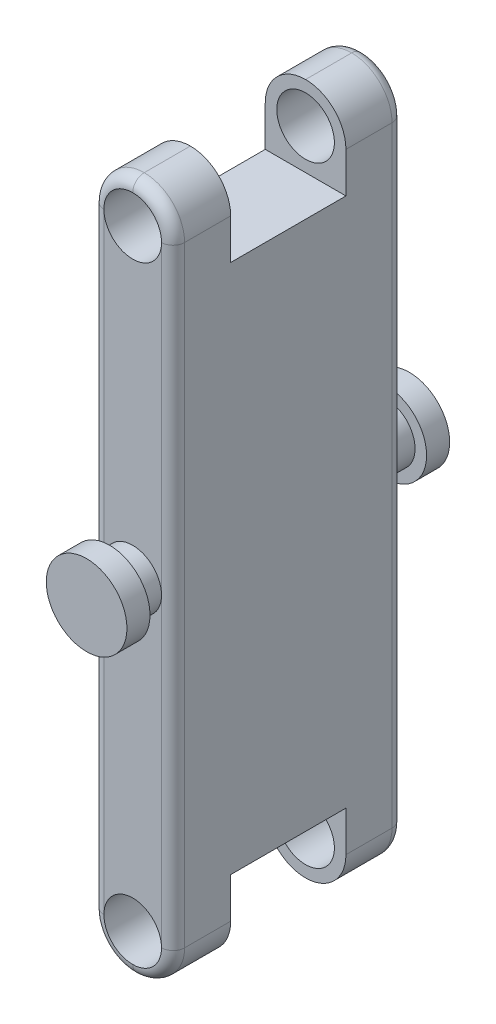
ISO-10303-21;
HEADER;
FILE_DESCRIPTION(('STEP AP214'),'2;1');
FILE_NAME('part.step','',(''),(''),'','','');
FILE_SCHEMA(('AUTOMOTIVE_DESIGN { 1 0 10303 214 1 1 1 1 }'));
ENDSEC;
DATA;
#1=APPLICATION_CONTEXT('core data for automotive mechanical design processes');
#2=APPLICATION_PROTOCOL_DEFINITION('international standard','automotive_design',2000,#1);
#3=PRODUCT_CONTEXT('',#1,'mechanical');
#4=PRODUCT('Part','Part','',(#3));
#5=PRODUCT_RELATED_PRODUCT_CATEGORY('part','',(#4));
#6=PRODUCT_DEFINITION_FORMATION('','',#4);
#7=PRODUCT_DEFINITION_CONTEXT('part definition',#1,'design');
#8=PRODUCT_DEFINITION('design','',#6,#7);
#9=PRODUCT_DEFINITION_SHAPE('','',#8);
#10=(LENGTH_UNIT() NAMED_UNIT(*) SI_UNIT(.MILLI.,.METRE.));
#11=(NAMED_UNIT(*) PLANE_ANGLE_UNIT() SI_UNIT($,.RADIAN.));
#12=(NAMED_UNIT(*) SI_UNIT($,.STERADIAN.) SOLID_ANGLE_UNIT());
#13=UNCERTAINTY_MEASURE_WITH_UNIT(LENGTH_MEASURE(1.E-05),#10,'distance_accuracy_value','');
#14=(GEOMETRIC_REPRESENTATION_CONTEXT(3) GLOBAL_UNCERTAINTY_ASSIGNED_CONTEXT((#13)) GLOBAL_UNIT_ASSIGNED_CONTEXT((#10,
#11,#12)) REPRESENTATION_CONTEXT('',''));
#15=CARTESIAN_POINT('',(0.,0.,0.));
#16=DIRECTION('',(0.,0.,1.));
#17=DIRECTION('',(1.,0.,0.));
#18=AXIS2_PLACEMENT_3D('',#15,#16,#17);
#19=CARTESIAN_POINT('',(0.,120.,-20.));
#20=DIRECTION('',(0.,0.,-1.));
#21=DIRECTION('',(-1.,0.,0.));
#22=AXIS2_PLACEMENT_3D('',#19,#20,#21);
#23=PLANE('',#22);
#24=CARTESIAN_POINT('',(7.00000000000001,113.,-20.));
#25=DIRECTION('',(0.,0.,-1.));
#26=DIRECTION('',(-1.,0.,0.));
#27=AXIS2_PLACEMENT_3D('',#24,#25,#26);
#28=CIRCLE('',#27,5.);
#29=CARTESIAN_POINT('',(12.,113.,-20.));
#30=VERTEX_POINT('',#29);
#31=CARTESIAN_POINT('',(1.99999999999999,113.,-20.));
#32=VERTEX_POINT('',#31);
#33=EDGE_CURVE('E511',#30,#32,#28,.T.);
#34=ORIENTED_EDGE('',*,*,#33,.F.);
#35=DIRECTION('',(0.,-1.,0.));
#36=VECTOR('',#35,1.);
#37=CARTESIAN_POINT('',(12.,7.00000000000001,-20.));
#38=LINE('',#37,#36);
#39=CARTESIAN_POINT('',(12.,60.,-20.));
#40=VERTEX_POINT('',#39);
#41=EDGE_CURVE('E372',#30,#40,#38,.T.);
#42=ORIENTED_EDGE('',*,*,#41,.T.);
#43=CARTESIAN_POINT('',(7.,60.,-20.));
#44=DIRECTION('',(0.,0.,-1.));
#45=DIRECTION('',(-1.,0.,0.));
#46=AXIS2_PLACEMENT_3D('',#43,#44,#45);
#47=CIRCLE('',#46,5.);
#48=CARTESIAN_POINT('',(1.99999999999999,60.,-20.));
#49=VERTEX_POINT('',#48);
#50=EDGE_CURVE('E342',#49,#40,#47,.T.);
#51=ORIENTED_EDGE('',*,*,#50,.F.);
#52=DIRECTION('',(0.,-1.,0.));
#53=VECTOR('',#52,1.);
#54=CARTESIAN_POINT('',(1.99999999999999,113.,-20.));
#55=LINE('',#54,#53);
#56=EDGE_CURVE('E366',#49,#32,#55,.F.);
#57=ORIENTED_EDGE('',*,*,#56,.T.);
#58=EDGE_LOOP('',(#34,#42,#51,#57));
#59=FACE_BOUND('',#58,.T.);
#60=ADVANCED_FACE('F37',(#59),#23,.T.);
#61=CARTESIAN_POINT('',(0.,120.,20.));
#62=DIRECTION('',(0.,0.,-1.));
#63=DIRECTION('',(-1.,0.,0.));
#64=AXIS2_PLACEMENT_3D('',#61,#62,#63);
#65=PLANE('',#64);
#66=CARTESIAN_POINT('',(7.,7.,20.));
#67=DIRECTION('',(0.,0.,-1.));
#68=DIRECTION('',(-1.,0.,0.));
#69=AXIS2_PLACEMENT_3D('',#66,#67,#68);
#70=CIRCLE('',#69,5.);
#71=CARTESIAN_POINT('',(2.00000000000001,7.,20.));
#72=VERTEX_POINT('',#71);
#73=CARTESIAN_POINT('',(12.,7.00000000000001,20.));
#74=VERTEX_POINT('',#73);
#75=EDGE_CURVE('E261',#72,#74,#70,.T.);
#76=ORIENTED_EDGE('',*,*,#75,.T.);
#77=DIRECTION('',(0.,-1.,0.));
#78=VECTOR('',#77,1.);
#79=CARTESIAN_POINT('',(12.,120.,20.));
#80=LINE('',#79,#78);
#81=CARTESIAN_POINT('',(12.,60.,20.));
#82=VERTEX_POINT('',#81);
#83=EDGE_CURVE('E351',#74,#82,#80,.F.);
#84=ORIENTED_EDGE('',*,*,#83,.T.);
#85=CARTESIAN_POINT('',(7.,60.,20.));
#86=DIRECTION('',(0.,0.,-1.));
#87=DIRECTION('',(-1.,0.,0.));
#88=AXIS2_PLACEMENT_3D('',#85,#86,#87);
#89=CIRCLE('',#88,5.);
#90=CARTESIAN_POINT('',(2.00000000000001,60.,20.));
#91=VERTEX_POINT('',#90);
#92=EDGE_CURVE('E338',#91,#82,#89,.F.);
#93=ORIENTED_EDGE('',*,*,#92,.F.);
#94=DIRECTION('',(0.,-1.,0.));
#95=VECTOR('',#94,1.);
#96=CARTESIAN_POINT('',(2.00000000000001,120.,20.));
#97=LINE('',#96,#95);
#98=EDGE_CURVE('E345',#91,#72,#97,.T.);
#99=ORIENTED_EDGE('',*,*,#98,.T.);
#100=EDGE_LOOP('',(#76,#84,#93,#99));
#101=FACE_BOUND('',#100,.T.);
#102=ADVANCED_FACE('F457',(#101),#65,.F.);
#103=EDGE_CURVE('E325',#82,#91,#89,.F.);
#104=ORIENTED_EDGE('',*,*,#103,.F.);
#105=DIRECTION('',(0.,-1.,0.));
#106=VECTOR('',#105,1.);
#107=CARTESIAN_POINT('',(12.,120.,20.));
#108=LINE('',#107,#106);
#109=CARTESIAN_POINT('',(12.,113.,20.));
#110=VERTEX_POINT('',#109);
#111=EDGE_CURVE('E349',#82,#110,#108,.F.);
#112=ORIENTED_EDGE('',*,*,#111,.T.);
#113=CARTESIAN_POINT('',(7.00000000000001,113.,20.));
#114=DIRECTION('',(0.,0.,-1.));
#115=DIRECTION('',(-1.,0.,0.));
#116=AXIS2_PLACEMENT_3D('',#113,#114,#115);
#117=CIRCLE('',#116,5.);
#118=CARTESIAN_POINT('',(2.00000000000001,113.,20.));
#119=VERTEX_POINT('',#118);
#120=EDGE_CURVE('E252',#110,#119,#117,.T.);
#121=ORIENTED_EDGE('',*,*,#120,.T.);
#122=DIRECTION('',(0.,-1.,0.));
#123=VECTOR('',#122,1.);
#124=CARTESIAN_POINT('',(2.00000000000001,120.,20.));
#125=LINE('',#124,#123);
#126=EDGE_CURVE('E347',#119,#91,#125,.T.);
#127=ORIENTED_EDGE('',*,*,#126,.T.);
#128=EDGE_LOOP('',(#104,#112,#121,#127));
#129=FACE_BOUND('',#128,.T.);
#130=ADVANCED_FACE('F464',(#129),#65,.F.);
#131=EDGE_CURVE('E341',#40,#49,#47,.T.);
#132=ORIENTED_EDGE('',*,*,#131,.F.);
#133=DIRECTION('',(0.,-1.,0.));
#134=VECTOR('',#133,1.);
#135=CARTESIAN_POINT('',(12.,7.00000000000001,-20.));
#136=LINE('',#135,#134);
#137=CARTESIAN_POINT('',(12.,7.00000000000001,-20.));
#138=VERTEX_POINT('',#137);
#139=EDGE_CURVE('E370',#40,#138,#136,.T.);
#140=ORIENTED_EDGE('',*,*,#139,.T.);
#141=CARTESIAN_POINT('',(7.,7.,-20.));
#142=DIRECTION('',(0.,0.,-1.));
#143=DIRECTION('',(-1.,0.,0.));
#144=AXIS2_PLACEMENT_3D('',#141,#142,#143);
#145=CIRCLE('',#144,5.);
#146=CARTESIAN_POINT('',(1.99999999999999,7.,-20.));
#147=VERTEX_POINT('',#146);
#148=EDGE_CURVE('E230',#147,#138,#145,.T.);
#149=ORIENTED_EDGE('',*,*,#148,.F.);
#150=DIRECTION('',(0.,-1.,0.));
#151=VECTOR('',#150,1.);
#152=CARTESIAN_POINT('',(1.99999999999999,113.,-20.));
#153=LINE('',#152,#151);
#154=EDGE_CURVE('E368',#147,#49,#153,.F.);
#155=ORIENTED_EDGE('',*,*,#154,.T.);
#156=EDGE_LOOP('',(#132,#140,#149,#155));
#157=FACE_BOUND('',#156,.T.);
#158=ADVANCED_FACE('F460',(#157),#23,.T.);
#159=CARTESIAN_POINT('',(0.,106.,-10.));
#160=DIRECTION('',(0.,0.,1.));
#161=DIRECTION('',(1.,0.,0.));
#162=AXIS2_PLACEMENT_3D('',#159,#160,#161);
#163=PLANE('',#162);
#164=CARTESIAN_POINT('',(7.,113.,-10.));
#165=DIRECTION('',(0.,0.,1.));
#166=DIRECTION('',(1.,0.,0.));
#167=AXIS2_PLACEMENT_3D('',#164,#165,#166);
#168=CIRCLE('',#167,7.);
#169=CARTESIAN_POINT('',(14.,113.,-10.));
#170=VERTEX_POINT('',#169);
#171=CARTESIAN_POINT('',(7.,120.,-10.));
#172=VERTEX_POINT('',#171);
#173=EDGE_CURVE('E299',#170,#172,#168,.T.);
#174=ORIENTED_EDGE('',*,*,#173,.T.);
#175=CARTESIAN_POINT('',(6.99999999999999,113.,-10.));
#176=DIRECTION('',(0.,0.,1.));
#177=DIRECTION('',(1.,0.,0.));
#178=AXIS2_PLACEMENT_3D('',#175,#176,#177);
#179=CIRCLE('',#178,7.);
#180=CARTESIAN_POINT('',(0.,113.,-10.));
#181=VERTEX_POINT('',#180);
#182=EDGE_CURVE('E301',#172,#181,#179,.T.);
#183=ORIENTED_EDGE('',*,*,#182,.T.);
#184=DIRECTION('',(0.,1.,0.));
#185=VECTOR('',#184,1.);
#186=CARTESIAN_POINT('',(0.,106.,-10.));
#187=LINE('',#186,#185);
#188=CARTESIAN_POINT('',(0.,106.,-10.));
#189=VERTEX_POINT('',#188);
#190=EDGE_CURVE('E219',#189,#181,#187,.T.);
#191=ORIENTED_EDGE('',*,*,#190,.F.);
#192=DIRECTION('',(1.,0.,0.));
#193=VECTOR('',#192,1.);
#194=CARTESIAN_POINT('',(0.,106.,-10.));
#195=LINE('',#194,#193);
#196=CARTESIAN_POINT('',(14.,106.,-10.));
#197=VERTEX_POINT('',#196);
#198=EDGE_CURVE('E204',#189,#197,#195,.T.);
#199=ORIENTED_EDGE('',*,*,#198,.T.);
#200=DIRECTION('',(0.,1.,0.));
#201=VECTOR('',#200,1.);
#202=CARTESIAN_POINT('',(14.,106.,-10.));
#203=LINE('',#202,#201);
#204=EDGE_CURVE('E216',#197,#170,#203,.T.);
#205=ORIENTED_EDGE('',*,*,#204,.T.);
#206=EDGE_LOOP('',(#174,#183,#191,#199,#205));
#207=FACE_BOUND('',#206,.T.);
#208=CARTESIAN_POINT('',(7.00000000000001,113.,-10.));
#209=DIRECTION('',(0.,0.,-1.));
#210=DIRECTION('',(-1.,0.,0.));
#211=AXIS2_PLACEMENT_3D('',#208,#209,#210);
#212=CIRCLE('',#211,5.);
#213=CARTESIAN_POINT('',(2.00000000000001,113.,-10.));
#214=VERTEX_POINT('',#213);
#215=EDGE_CURVE('E329',#214,#214,#212,.T.);
#216=ORIENTED_EDGE('',*,*,#215,.T.);
#217=EDGE_LOOP('',(#216));
#218=FACE_BOUND('',#217,.T.);
#219=ADVANCED_FACE('F214',(#207,#218),#163,.T.);
#220=CARTESIAN_POINT('',(0.,120.,0.));
#221=DIRECTION('',(1.,0.,0.));
#222=DIRECTION('',(0.,0.,-1.));
#223=AXIS2_PLACEMENT_3D('',#220,#221,#222);
#224=PLANE('',#223);
#225=DIRECTION('',(0.,0.,1.));
#226=VECTOR('',#225,1.);
#227=CARTESIAN_POINT('',(0.,7.00000000000001,0.));
#228=LINE('',#227,#226);
#229=CARTESIAN_POINT('',(0.,7.00000000000001,10.));
#230=VERTEX_POINT('',#229);
#231=CARTESIAN_POINT('',(0.,7.00000000000001,18.));
#232=VERTEX_POINT('',#231);
#233=EDGE_CURVE('E277',#230,#232,#228,.T.);
#234=ORIENTED_EDGE('',*,*,#233,.T.);
#235=DIRECTION('',(0.,-1.,0.));
#236=VECTOR('',#235,1.);
#237=CARTESIAN_POINT('',(0.,120.,18.));
#238=LINE('',#237,#236);
#239=CARTESIAN_POINT('',(0.,113.,18.));
#240=VERTEX_POINT('',#239);
#241=EDGE_CURVE('E11',#232,#240,#238,.F.);
#242=ORIENTED_EDGE('',*,*,#241,.T.);
#243=DIRECTION('',(0.,0.,1.));
#244=VECTOR('',#243,1.);
#245=CARTESIAN_POINT('',(0.,113.,10.));
#246=LINE('',#245,#244);
#247=CARTESIAN_POINT('',(0.,113.,10.));
#248=VERTEX_POINT('',#247);
#249=EDGE_CURVE('E295',#240,#248,#246,.F.);
#250=ORIENTED_EDGE('',*,*,#249,.T.);
#251=DIRECTION('',(0.,1.,0.));
#252=VECTOR('',#251,1.);
#253=CARTESIAN_POINT('',(0.,106.,10.));
#254=LINE('',#253,#252);
#255=CARTESIAN_POINT('',(0.,106.,10.));
#256=VERTEX_POINT('',#255);
#257=EDGE_CURVE('E210',#256,#248,#254,.T.);
#258=ORIENTED_EDGE('',*,*,#257,.F.);
#259=DIRECTION('',(0.,0.,1.));
#260=VECTOR('',#259,1.);
#261=CARTESIAN_POINT('',(0.,106.,0.));
#262=LINE('',#261,#260);
#263=EDGE_CURVE('E250',#189,#256,#262,.T.);
#264=ORIENTED_EDGE('',*,*,#263,.F.);
#265=ORIENTED_EDGE('',*,*,#190,.T.);
#266=DIRECTION('',(0.,0.,-1.));
#267=VECTOR('',#266,1.);
#268=CARTESIAN_POINT('',(0.,113.,-20.));
#269=LINE('',#268,#267);
#270=CARTESIAN_POINT('',(0.,113.,-18.));
#271=VERTEX_POINT('',#270);
#272=EDGE_CURVE('E297',#181,#271,#269,.T.);
#273=ORIENTED_EDGE('',*,*,#272,.T.);
#274=DIRECTION('',(0.,-1.,0.));
#275=VECTOR('',#274,1.);
#276=CARTESIAN_POINT('',(0.,7.00000000000001,-18.));
#277=LINE('',#276,#275);
#278=CARTESIAN_POINT('',(0.,7.00000000000001,-18.));
#279=VERTEX_POINT('',#278);
#280=EDGE_CURVE('E46',#271,#279,#277,.T.);
#281=ORIENTED_EDGE('',*,*,#280,.T.);
#282=DIRECTION('',(0.,0.,-1.));
#283=VECTOR('',#282,1.);
#284=CARTESIAN_POINT('',(0.,7.00000000000001,0.));
#285=LINE('',#284,#283);
#286=CARTESIAN_POINT('',(0.,7.,-10.));
#287=VERTEX_POINT('',#286);
#288=EDGE_CURVE('E293',#279,#287,#285,.F.);
#289=ORIENTED_EDGE('',*,*,#288,.T.);
#290=DIRECTION('',(0.,-1.,0.));
#291=VECTOR('',#290,1.);
#292=CARTESIAN_POINT('',(0.,14.,-10.));
#293=LINE('',#292,#291);
#294=CARTESIAN_POINT('',(0.,14.,-10.));
#295=VERTEX_POINT('',#294);
#296=EDGE_CURVE('E240',#295,#287,#293,.T.);
#297=ORIENTED_EDGE('',*,*,#296,.F.);
#298=DIRECTION('',(0.,0.,-1.));
#299=VECTOR('',#298,1.);
#300=CARTESIAN_POINT('',(0.,14.,0.));
#301=LINE('',#300,#299);
#302=CARTESIAN_POINT('',(0.,14.,10.));
#303=VERTEX_POINT('',#302);
#304=EDGE_CURVE('E264',#303,#295,#301,.T.);
#305=ORIENTED_EDGE('',*,*,#304,.F.);
#306=DIRECTION('',(0.,-1.,0.));
#307=VECTOR('',#306,1.);
#308=CARTESIAN_POINT('',(0.,14.,10.));
#309=LINE('',#308,#307);
#310=EDGE_CURVE('E274',#303,#230,#309,.T.);
#311=ORIENTED_EDGE('',*,*,#310,.T.);
#312=EDGE_LOOP('',(#234,#242,#250,#258,#264,#265,#273,#281,#289,#297,#305,#311));
#313=FACE_BOUND('',#312,.T.);
#314=ADVANCED_FACE('F439',(#313),#224,.F.);
#315=CARTESIAN_POINT('',(14.,120.,0.));
#316=DIRECTION('',(-1.,0.,0.));
#317=DIRECTION('',(0.,0.,1.));
#318=AXIS2_PLACEMENT_3D('',#315,#316,#317);
#319=PLANE('',#318);
#320=DIRECTION('',(0.,0.,-1.));
#321=VECTOR('',#320,1.);
#322=CARTESIAN_POINT('',(14.,113.,20.));
#323=LINE('',#322,#321);
#324=CARTESIAN_POINT('',(14.,113.,10.));
#325=VERTEX_POINT('',#324);
#326=CARTESIAN_POINT('',(14.,113.,18.));
#327=VERTEX_POINT('',#326);
#328=EDGE_CURVE('E308',#325,#327,#323,.F.);
#329=ORIENTED_EDGE('',*,*,#328,.T.);
#330=DIRECTION('',(0.,-1.,0.));
#331=VECTOR('',#330,1.);
#332=CARTESIAN_POINT('',(14.,120.,18.));
#333=LINE('',#332,#331);
#334=CARTESIAN_POINT('',(14.,7.00000000000001,18.));
#335=VERTEX_POINT('',#334);
#336=EDGE_CURVE('E360',#327,#335,#333,.T.);
#337=ORIENTED_EDGE('',*,*,#336,.T.);
#338=DIRECTION('',(0.,0.,-1.));
#339=VECTOR('',#338,1.);
#340=CARTESIAN_POINT('',(14.,7.00000000000001,0.));
#341=LINE('',#340,#339);
#342=CARTESIAN_POINT('',(14.,7.00000000000001,10.));
#343=VERTEX_POINT('',#342);
#344=EDGE_CURVE('E303',#335,#343,#341,.T.);
#345=ORIENTED_EDGE('',*,*,#344,.T.);
#346=DIRECTION('',(0.,-1.,0.));
#347=VECTOR('',#346,1.);
#348=CARTESIAN_POINT('',(14.,14.,10.));
#349=LINE('',#348,#347);
#350=CARTESIAN_POINT('',(14.,14.,10.));
#351=VERTEX_POINT('',#350);
#352=EDGE_CURVE('E272',#351,#343,#349,.T.);
#353=ORIENTED_EDGE('',*,*,#352,.F.);
#354=DIRECTION('',(0.,0.,1.));
#355=VECTOR('',#354,1.);
#356=CARTESIAN_POINT('',(14.,14.,0.));
#357=LINE('',#356,#355);
#358=CARTESIAN_POINT('',(14.,14.,-10.));
#359=VERTEX_POINT('',#358);
#360=EDGE_CURVE('E273',#359,#351,#357,.T.);
#361=ORIENTED_EDGE('',*,*,#360,.F.);
#362=DIRECTION('',(0.,-1.,0.));
#363=VECTOR('',#362,1.);
#364=CARTESIAN_POINT('',(14.,14.,-10.));
#365=LINE('',#364,#363);
#366=CARTESIAN_POINT('',(14.,7.,-10.));
#367=VERTEX_POINT('',#366);
#368=EDGE_CURVE('E241',#359,#367,#365,.T.);
#369=ORIENTED_EDGE('',*,*,#368,.T.);
#370=DIRECTION('',(0.,0.,1.));
#371=VECTOR('',#370,1.);
#372=CARTESIAN_POINT('',(14.,7.00000000000001,0.));
#373=LINE('',#372,#371);
#374=CARTESIAN_POINT('',(14.,7.00000000000001,-18.));
#375=VERTEX_POINT('',#374);
#376=EDGE_CURVE('E305',#367,#375,#373,.F.);
#377=ORIENTED_EDGE('',*,*,#376,.T.);
#378=DIRECTION('',(0.,-1.,0.));
#379=VECTOR('',#378,1.);
#380=CARTESIAN_POINT('',(14.,113.,-18.));
#381=LINE('',#380,#379);
#382=CARTESIAN_POINT('',(14.,113.,-18.));
#383=VERTEX_POINT('',#382);
#384=EDGE_CURVE('E358',#375,#383,#381,.F.);
#385=ORIENTED_EDGE('',*,*,#384,.T.);
#386=DIRECTION('',(0.,0.,1.));
#387=VECTOR('',#386,1.);
#388=CARTESIAN_POINT('',(14.,113.,-10.));
#389=LINE('',#388,#387);
#390=EDGE_CURVE('E225',#383,#170,#389,.T.);
#391=ORIENTED_EDGE('',*,*,#390,.T.);
#392=ORIENTED_EDGE('',*,*,#204,.F.);
#393=DIRECTION('',(0.,0.,-1.));
#394=VECTOR('',#393,1.);
#395=CARTESIAN_POINT('',(14.,106.,0.));
#396=LINE('',#395,#394);
#397=CARTESIAN_POINT('',(14.,106.,10.));
#398=VERTEX_POINT('',#397);
#399=EDGE_CURVE('E200',#398,#197,#396,.T.);
#400=ORIENTED_EDGE('',*,*,#399,.F.);
#401=DIRECTION('',(0.,1.,0.));
#402=VECTOR('',#401,1.);
#403=CARTESIAN_POINT('',(14.,106.,10.));
#404=LINE('',#403,#402);
#405=EDGE_CURVE('E256',#398,#325,#404,.T.);
#406=ORIENTED_EDGE('',*,*,#405,.T.);
#407=EDGE_LOOP('',(#329,#337,#345,#353,#361,#369,#377,#385,#391,#392,#400,#406));
#408=FACE_BOUND('',#407,.T.);
#409=ADVANCED_FACE('F223',(#408),#319,.F.);
#410=CARTESIAN_POINT('',(0.,14.,-10.));
#411=DIRECTION('',(0.,0.,1.));
#412=DIRECTION('',(1.,0.,0.));
#413=AXIS2_PLACEMENT_3D('',#410,#411,#412);
#414=PLANE('',#413);
#415=ORIENTED_EDGE('',*,*,#296,.T.);
#416=CARTESIAN_POINT('',(6.99999999999999,7.,-10.));
#417=DIRECTION('',(0.,0.,1.));
#418=DIRECTION('',(1.,0.,0.));
#419=AXIS2_PLACEMENT_3D('',#416,#417,#418);
#420=CIRCLE('',#419,7.);
#421=CARTESIAN_POINT('',(7.,0.,-10.));
#422=VERTEX_POINT('',#421);
#423=EDGE_CURVE('E318',#287,#422,#420,.T.);
#424=ORIENTED_EDGE('',*,*,#423,.T.);
#425=CARTESIAN_POINT('',(7.,7.,-10.));
#426=DIRECTION('',(0.,0.,1.));
#427=DIRECTION('',(1.,0.,0.));
#428=AXIS2_PLACEMENT_3D('',#425,#426,#427);
#429=CIRCLE('',#428,7.);
#430=EDGE_CURVE('E316',#422,#367,#429,.T.);
#431=ORIENTED_EDGE('',*,*,#430,.T.);
#432=ORIENTED_EDGE('',*,*,#368,.F.);
#433=DIRECTION('',(-1.,0.,0.));
#434=VECTOR('',#433,1.);
#435=CARTESIAN_POINT('',(0.,14.,-10.));
#436=LINE('',#435,#434);
#437=EDGE_CURVE('E233',#359,#295,#436,.T.);
#438=ORIENTED_EDGE('',*,*,#437,.T.);
#439=EDGE_LOOP('',(#415,#424,#431,#432,#438));
#440=FACE_BOUND('',#439,.T.);
#441=CARTESIAN_POINT('',(7.00000000000001,7.,-10.));
#442=DIRECTION('',(0.,0.,-1.));
#443=DIRECTION('',(-1.,0.,0.));
#444=AXIS2_PLACEMENT_3D('',#441,#442,#443);
#445=CIRCLE('',#444,5.);
#446=CARTESIAN_POINT('',(2.00000000000001,7.,-10.));
#447=VERTEX_POINT('',#446);
#448=EDGE_CURVE('E227',#447,#447,#445,.T.);
#449=ORIENTED_EDGE('',*,*,#448,.T.);
#450=EDGE_LOOP('',(#449));
#451=FACE_BOUND('',#450,.T.);
#452=ADVANCED_FACE('F432',(#440,#451),#414,.T.);
#453=CARTESIAN_POINT('',(0.,14.,10.));
#454=DIRECTION('',(0.,0.,1.));
#455=DIRECTION('',(1.,0.,0.));
#456=AXIS2_PLACEMENT_3D('',#453,#454,#455);
#457=PLANE('',#456);
#458=CARTESIAN_POINT('',(7.00000000000001,7.,10.));
#459=DIRECTION('',(0.,0.,-1.));
#460=DIRECTION('',(-1.,0.,0.));
#461=AXIS2_PLACEMENT_3D('',#458,#459,#460);
#462=CIRCLE('',#461,5.);
#463=CARTESIAN_POINT('',(2.00000000000001,7.,10.));
#464=VERTEX_POINT('',#463);
#465=EDGE_CURVE('E258',#464,#464,#462,.T.);
#466=ORIENTED_EDGE('',*,*,#465,.F.);
#467=EDGE_LOOP('',(#466));
#468=FACE_BOUND('',#467,.T.);
#469=CARTESIAN_POINT('',(7.00000000000001,7.00000000000001,10.));
#470=DIRECTION('',(0.,0.,1.));
#471=DIRECTION('',(1.,0.,0.));
#472=AXIS2_PLACEMENT_3D('',#469,#470,#471);
#473=CIRCLE('',#472,7.);
#474=CARTESIAN_POINT('',(7.00000000000001,0.,10.));
#475=VERTEX_POINT('',#474);
#476=EDGE_CURVE('E321',#343,#475,#473,.F.);
#477=ORIENTED_EDGE('',*,*,#476,.T.);
#478=CARTESIAN_POINT('',(7.00000000000001,7.00000000000001,10.));
#479=DIRECTION('',(0.,0.,1.));
#480=DIRECTION('',(1.,0.,0.));
#481=AXIS2_PLACEMENT_3D('',#478,#479,#480);
#482=CIRCLE('',#481,7.);
#483=EDGE_CURVE('E323',#475,#230,#482,.F.);
#484=ORIENTED_EDGE('',*,*,#483,.T.);
#485=ORIENTED_EDGE('',*,*,#310,.F.);
#486=DIRECTION('',(-1.,0.,0.));
#487=VECTOR('',#486,1.);
#488=CARTESIAN_POINT('',(0.,14.,10.));
#489=LINE('',#488,#487);
#490=EDGE_CURVE('E269',#351,#303,#489,.T.);
#491=ORIENTED_EDGE('',*,*,#490,.F.);
#492=ORIENTED_EDGE('',*,*,#352,.T.);
#493=EDGE_LOOP('',(#477,#484,#485,#491,#492));
#494=FACE_BOUND('',#493,.T.);
#495=ADVANCED_FACE('F578',(#468,#494),#457,.F.);
#496=CARTESIAN_POINT('',(0.,14.,0.));
#497=DIRECTION('',(0.,1.,0.));
#498=DIRECTION('',(0.,0.,1.));
#499=AXIS2_PLACEMENT_3D('',#496,#497,#498);
#500=PLANE('',#499);
#501=ORIENTED_EDGE('',*,*,#304,.T.);
#502=ORIENTED_EDGE('',*,*,#437,.F.);
#503=ORIENTED_EDGE('',*,*,#360,.T.);
#504=ORIENTED_EDGE('',*,*,#490,.T.);
#505=EDGE_LOOP('',(#501,#502,#503,#504));
#506=FACE_BOUND('',#505,.T.);
#507=ADVANCED_FACE('F436',(#506),#500,.F.);
#508=CARTESIAN_POINT('',(7.,7.,20.));
#509=DIRECTION('',(0.,0.,-1.));
#510=DIRECTION('',(-1.,0.,0.));
#511=AXIS2_PLACEMENT_3D('',#508,#509,#510);
#512=CYLINDRICAL_SURFACE('',#511,5.);
#513=ORIENTED_EDGE('',*,*,#75,.F.);
#514=CARTESIAN_POINT('',(7.00000000000001,2.,20.));
#515=VERTEX_POINT('',#514);
#516=EDGE_CURVE('E266',#515,#72,#70,.T.);
#517=ORIENTED_EDGE('',*,*,#516,.F.);
#518=EDGE_CURVE('E265',#74,#515,#70,.T.);
#519=ORIENTED_EDGE('',*,*,#518,.F.);
#520=EDGE_LOOP('',(#513,#517,#519));
#521=FACE_BOUND('',#520,.T.);
#522=ORIENTED_EDGE('',*,*,#465,.T.);
#523=EDGE_LOOP('',(#522));
#524=FACE_BOUND('',#523,.T.);
#525=ADVANCED_FACE('F758',(#521,#524),#512,.F.);
#526=CARTESIAN_POINT('',(0.,106.,10.));
#527=DIRECTION('',(0.,0.,1.));
#528=DIRECTION('',(1.,0.,0.));
#529=AXIS2_PLACEMENT_3D('',#526,#527,#528);
#530=PLANE('',#529);
#531=CARTESIAN_POINT('',(7.00000000000001,113.,10.));
#532=DIRECTION('',(0.,0.,-1.));
#533=DIRECTION('',(-1.,0.,0.));
#534=AXIS2_PLACEMENT_3D('',#531,#532,#533);
#535=CIRCLE('',#534,5.);
#536=CARTESIAN_POINT('',(2.00000000000001,113.,10.));
#537=VERTEX_POINT('',#536);
#538=EDGE_CURVE('E244',#537,#537,#535,.T.);
#539=ORIENTED_EDGE('',*,*,#538,.F.);
#540=EDGE_LOOP('',(#539));
#541=FACE_BOUND('',#540,.T.);
#542=ORIENTED_EDGE('',*,*,#257,.T.);
#543=CARTESIAN_POINT('',(7.00000000000001,113.,10.));
#544=DIRECTION('',(0.,0.,1.));
#545=DIRECTION('',(1.,0.,0.));
#546=AXIS2_PLACEMENT_3D('',#543,#544,#545);
#547=CIRCLE('',#546,7.);
#548=CARTESIAN_POINT('',(7.00000000000001,120.,10.));
#549=VERTEX_POINT('',#548);
#550=EDGE_CURVE('E313',#248,#549,#547,.F.);
#551=ORIENTED_EDGE('',*,*,#550,.T.);
#552=CARTESIAN_POINT('',(7.00000000000001,113.,10.));
#553=DIRECTION('',(0.,0.,1.));
#554=DIRECTION('',(1.,0.,0.));
#555=AXIS2_PLACEMENT_3D('',#552,#553,#554);
#556=CIRCLE('',#555,7.);
#557=EDGE_CURVE('E311',#549,#325,#556,.F.);
#558=ORIENTED_EDGE('',*,*,#557,.T.);
#559=ORIENTED_EDGE('',*,*,#405,.F.);
#560=DIRECTION('',(1.,0.,0.));
#561=VECTOR('',#560,1.);
#562=CARTESIAN_POINT('',(0.,106.,10.));
#563=LINE('',#562,#561);
#564=EDGE_CURVE('E206',#256,#398,#563,.T.);
#565=ORIENTED_EDGE('',*,*,#564,.F.);
#566=EDGE_LOOP('',(#542,#551,#558,#559,#565));
#567=FACE_BOUND('',#566,.T.);
#568=ADVANCED_FACE('F611',(#541,#567),#530,.F.);
#569=CARTESIAN_POINT('',(0.,106.,0.));
#570=DIRECTION('',(0.,1.,0.));
#571=DIRECTION('',(0.,0.,1.));
#572=AXIS2_PLACEMENT_3D('',#569,#570,#571);
#573=PLANE('',#572);
#574=ORIENTED_EDGE('',*,*,#263,.T.);
#575=ORIENTED_EDGE('',*,*,#564,.T.);
#576=ORIENTED_EDGE('',*,*,#399,.T.);
#577=ORIENTED_EDGE('',*,*,#198,.F.);
#578=EDGE_LOOP('',(#574,#575,#576,#577));
#579=FACE_BOUND('',#578,.T.);
#580=ADVANCED_FACE('F203',(#579),#573,.T.);
#581=CARTESIAN_POINT('',(7.00000000000001,113.,20.));
#582=DIRECTION('',(0.,0.,-1.));
#583=DIRECTION('',(-1.,0.,0.));
#584=AXIS2_PLACEMENT_3D('',#581,#582,#583);
#585=CYLINDRICAL_SURFACE('',#584,5.);
#586=CARTESIAN_POINT('',(7.00000000000001,118.,20.));
#587=VERTEX_POINT('',#586);
#588=EDGE_CURVE('E247',#119,#587,#117,.T.);
#589=ORIENTED_EDGE('',*,*,#588,.F.);
#590=ORIENTED_EDGE('',*,*,#120,.F.);
#591=EDGE_CURVE('E251',#587,#110,#117,.T.);
#592=ORIENTED_EDGE('',*,*,#591,.F.);
#593=EDGE_LOOP('',(#589,#590,#592));
#594=FACE_BOUND('',#593,.T.);
#595=ORIENTED_EDGE('',*,*,#538,.T.);
#596=EDGE_LOOP('',(#595));
#597=FACE_BOUND('',#596,.T.);
#598=ADVANCED_FACE('F575',(#594,#597),#585,.F.);
#599=CARTESIAN_POINT('',(7.,7.,-20.));
#600=DIRECTION('',(0.,0.,1.));
#601=DIRECTION('',(1.,0.,0.));
#602=AXIS2_PLACEMENT_3D('',#599,#600,#601);
#603=CYLINDRICAL_SURFACE('',#602,5.);
#604=ORIENTED_EDGE('',*,*,#148,.T.);
#605=CARTESIAN_POINT('',(7.,2.,-20.));
#606=VERTEX_POINT('',#605);
#607=EDGE_CURVE('E234',#138,#606,#145,.T.);
#608=ORIENTED_EDGE('',*,*,#607,.T.);
#609=EDGE_CURVE('E235',#606,#147,#145,.T.);
#610=ORIENTED_EDGE('',*,*,#609,.T.);
#611=EDGE_LOOP('',(#604,#608,#610));
#612=FACE_BOUND('',#611,.T.);
#613=ORIENTED_EDGE('',*,*,#448,.F.);
#614=EDGE_LOOP('',(#613));
#615=FACE_BOUND('',#614,.T.);
#616=ADVANCED_FACE('F572',(#612,#615),#603,.F.);
#617=CARTESIAN_POINT('',(7.00000000000001,113.,-20.));
#618=DIRECTION('',(0.,0.,1.));
#619=DIRECTION('',(1.,0.,0.));
#620=AXIS2_PLACEMENT_3D('',#617,#618,#619);
#621=CYLINDRICAL_SURFACE('',#620,5.);
#622=CARTESIAN_POINT('',(7.,118.,-20.));
#623=VERTEX_POINT('',#622);
#624=EDGE_CURVE('E220',#32,#623,#28,.T.);
#625=ORIENTED_EDGE('',*,*,#624,.T.);
#626=EDGE_CURVE('E494',#623,#30,#28,.T.);
#627=ORIENTED_EDGE('',*,*,#626,.T.);
#628=ORIENTED_EDGE('',*,*,#33,.T.);
#629=EDGE_LOOP('',(#625,#627,#628));
#630=FACE_BOUND('',#629,.T.);
#631=ORIENTED_EDGE('',*,*,#215,.F.);
#632=EDGE_LOOP('',(#631));
#633=FACE_BOUND('',#632,.T.);
#634=ADVANCED_FACE('F513',(#630,#633),#621,.F.);
#635=CARTESIAN_POINT('',(7.00000000000001,113.,0.));
#636=DIRECTION('',(0.,0.,-1.));
#637=DIRECTION('',(-1.,0.,0.));
#638=AXIS2_PLACEMENT_3D('',#635,#636,#637);
#639=CYLINDRICAL_SURFACE('',#638,7.);
#640=ORIENTED_EDGE('',*,*,#390,.F.);
#641=CARTESIAN_POINT('',(7.,113.,-18.));
#642=DIRECTION('',(0.,0.,-1.));
#643=DIRECTION('',(-1.,0.,0.));
#644=AXIS2_PLACEMENT_3D('',#641,#642,#643);
#645=CIRCLE('',#644,7.);
#646=CARTESIAN_POINT('',(7.,120.,-18.));
#647=VERTEX_POINT('',#646);
#648=EDGE_CURVE('E377',#383,#647,#645,.F.);
#649=ORIENTED_EDGE('',*,*,#648,.T.);
#650=DIRECTION('',(0.,0.,1.));
#651=VECTOR('',#650,1.);
#652=CARTESIAN_POINT('',(7.,120.,-20.));
#653=LINE('',#652,#651);
#654=EDGE_CURVE('E326',#172,#647,#653,.F.);
#655=ORIENTED_EDGE('',*,*,#654,.F.);
#656=ORIENTED_EDGE('',*,*,#173,.F.);
#657=EDGE_LOOP('',(#640,#649,#655,#656));
#658=FACE_BOUND('',#657,.T.);
#659=ADVANCED_FACE('F498',(#658),#639,.T.);
#660=CARTESIAN_POINT('',(7.,113.,0.));
#661=DIRECTION('',(0.,0.,1.));
#662=DIRECTION('',(1.,0.,0.));
#663=AXIS2_PLACEMENT_3D('',#660,#661,#662);
#664=CYLINDRICAL_SURFACE('',#663,7.);
#665=ORIENTED_EDGE('',*,*,#654,.T.);
#666=CARTESIAN_POINT('',(6.99999999999999,113.,-18.));
#667=DIRECTION('',(0.,0.,-1.));
#668=DIRECTION('',(-1.,0.,0.));
#669=AXIS2_PLACEMENT_3D('',#666,#667,#668);
#670=CIRCLE('',#669,7.);
#671=EDGE_CURVE('E374',#647,#271,#670,.F.);
#672=ORIENTED_EDGE('',*,*,#671,.T.);
#673=ORIENTED_EDGE('',*,*,#272,.F.);
#674=ORIENTED_EDGE('',*,*,#182,.F.);
#675=EDGE_LOOP('',(#665,#672,#673,#674));
#676=FACE_BOUND('',#675,.T.);
#677=ADVANCED_FACE('F502',(#676),#664,.T.);
#678=CARTESIAN_POINT('',(7.00000000000001,113.,0.));
#679=DIRECTION('',(0.,0.,1.));
#680=DIRECTION('',(1.,0.,0.));
#681=AXIS2_PLACEMENT_3D('',#678,#679,#680);
#682=CYLINDRICAL_SURFACE('',#681,7.);
#683=DIRECTION('',(0.,0.,-1.));
#684=VECTOR('',#683,1.);
#685=CARTESIAN_POINT('',(7.00000000000001,120.,10.));
#686=LINE('',#685,#684);
#687=CARTESIAN_POINT('',(7.00000000000001,120.,18.));
#688=VERTEX_POINT('',#687);
#689=EDGE_CURVE('E330',#688,#549,#686,.T.);
#690=ORIENTED_EDGE('',*,*,#689,.F.);
#691=CARTESIAN_POINT('',(7.00000000000001,113.,18.));
#692=DIRECTION('',(0.,0.,-1.));
#693=DIRECTION('',(-1.,0.,0.));
#694=AXIS2_PLACEMENT_3D('',#691,#692,#693);
#695=CIRCLE('',#694,7.);
#696=EDGE_CURVE('E356',#688,#327,#695,.T.);
#697=ORIENTED_EDGE('',*,*,#696,.T.);
#698=ORIENTED_EDGE('',*,*,#328,.F.);
#699=ORIENTED_EDGE('',*,*,#557,.F.);
#700=EDGE_LOOP('',(#690,#697,#698,#699));
#701=FACE_BOUND('',#700,.T.);
#702=ADVANCED_FACE('F594',(#701),#682,.T.);
#703=CARTESIAN_POINT('',(7.,113.,0.));
#704=DIRECTION('',(0.,0.,-1.));
#705=DIRECTION('',(-1.,0.,0.));
#706=AXIS2_PLACEMENT_3D('',#703,#704,#705);
#707=CYLINDRICAL_SURFACE('',#706,7.);
#708=ORIENTED_EDGE('',*,*,#249,.F.);
#709=CARTESIAN_POINT('',(7.00000000000001,113.,18.));
#710=DIRECTION('',(0.,0.,-1.));
#711=DIRECTION('',(-1.,0.,0.));
#712=AXIS2_PLACEMENT_3D('',#709,#710,#711);
#713=CIRCLE('',#712,7.);
#714=EDGE_CURVE('E353',#240,#688,#713,.T.);
#715=ORIENTED_EDGE('',*,*,#714,.T.);
#716=ORIENTED_EDGE('',*,*,#689,.T.);
#717=ORIENTED_EDGE('',*,*,#550,.F.);
#718=EDGE_LOOP('',(#708,#715,#716,#717));
#719=FACE_BOUND('',#718,.T.);
#720=ADVANCED_FACE('F453',(#719),#707,.T.);
#721=CARTESIAN_POINT('',(7.00000000000001,7.,0.));
#722=DIRECTION('',(0.,0.,1.));
#723=DIRECTION('',(1.,0.,0.));
#724=AXIS2_PLACEMENT_3D('',#721,#722,#723);
#725=CYLINDRICAL_SURFACE('',#724,7.);
#726=DIRECTION('',(0.,0.,1.));
#727=VECTOR('',#726,1.);
#728=CARTESIAN_POINT('',(7.00000000000001,0.,0.));
#729=LINE('',#728,#727);
#730=CARTESIAN_POINT('',(7.,0.,-18.));
#731=VERTEX_POINT('',#730);
#732=EDGE_CURVE('E332',#731,#422,#729,.T.);
#733=ORIENTED_EDGE('',*,*,#732,.F.);
#734=CARTESIAN_POINT('',(7.,7.,-18.));
#735=DIRECTION('',(0.,0.,-1.));
#736=DIRECTION('',(-1.,0.,0.));
#737=AXIS2_PLACEMENT_3D('',#734,#735,#736);
#738=CIRCLE('',#737,7.);
#739=EDGE_CURVE('E379',#731,#375,#738,.F.);
#740=ORIENTED_EDGE('',*,*,#739,.T.);
#741=ORIENTED_EDGE('',*,*,#376,.F.);
#742=ORIENTED_EDGE('',*,*,#430,.F.);
#743=EDGE_LOOP('',(#733,#740,#741,#742));
#744=FACE_BOUND('',#743,.T.);
#745=ADVANCED_FACE('F426',(#744),#725,.T.);
#746=CARTESIAN_POINT('',(7.,7.,0.));
#747=DIRECTION('',(0.,0.,-1.));
#748=DIRECTION('',(-1.,0.,0.));
#749=AXIS2_PLACEMENT_3D('',#746,#747,#748);
#750=CYLINDRICAL_SURFACE('',#749,7.);
#751=ORIENTED_EDGE('',*,*,#288,.F.);
#752=CARTESIAN_POINT('',(6.99999999999999,7.,-18.));
#753=DIRECTION('',(0.,0.,-1.));
#754=DIRECTION('',(-1.,0.,0.));
#755=AXIS2_PLACEMENT_3D('',#752,#753,#754);
#756=CIRCLE('',#755,7.);
#757=EDGE_CURVE('E60',#279,#731,#756,.F.);
#758=ORIENTED_EDGE('',*,*,#757,.T.);
#759=ORIENTED_EDGE('',*,*,#732,.T.);
#760=ORIENTED_EDGE('',*,*,#423,.F.);
#761=EDGE_LOOP('',(#751,#758,#759,#760));
#762=FACE_BOUND('',#761,.T.);
#763=ADVANCED_FACE('F442',(#762),#750,.T.);
#764=CARTESIAN_POINT('',(7.00000000000001,7.00000000000001,0.));
#765=DIRECTION('',(0.,0.,-1.));
#766=DIRECTION('',(-1.,0.,0.));
#767=AXIS2_PLACEMENT_3D('',#764,#765,#766);
#768=CYLINDRICAL_SURFACE('',#767,7.);
#769=ORIENTED_EDGE('',*,*,#344,.F.);
#770=CARTESIAN_POINT('',(7.00000000000001,7.00000000000001,18.));
#771=DIRECTION('',(0.,0.,-1.));
#772=DIRECTION('',(-1.,0.,0.));
#773=AXIS2_PLACEMENT_3D('',#770,#771,#772);
#774=CIRCLE('',#773,7.);
#775=CARTESIAN_POINT('',(7.00000000000001,0.,18.));
#776=VERTEX_POINT('',#775);
#777=EDGE_CURVE('E362',#335,#776,#774,.T.);
#778=ORIENTED_EDGE('',*,*,#777,.T.);
#779=DIRECTION('',(0.,0.,-1.));
#780=VECTOR('',#779,1.);
#781=CARTESIAN_POINT('',(7.00000000000001,0.,0.));
#782=LINE('',#781,#780);
#783=EDGE_CURVE('E334',#475,#776,#782,.F.);
#784=ORIENTED_EDGE('',*,*,#783,.F.);
#785=ORIENTED_EDGE('',*,*,#476,.F.);
#786=EDGE_LOOP('',(#769,#778,#784,#785));
#787=FACE_BOUND('',#786,.T.);
#788=ADVANCED_FACE('F444',(#787),#768,.T.);
#789=CARTESIAN_POINT('',(7.,7.00000000000001,0.));
#790=DIRECTION('',(0.,0.,1.));
#791=DIRECTION('',(1.,0.,0.));
#792=AXIS2_PLACEMENT_3D('',#789,#790,#791);
#793=CYLINDRICAL_SURFACE('',#792,7.);
#794=ORIENTED_EDGE('',*,*,#783,.T.);
#795=CARTESIAN_POINT('',(7.00000000000001,7.00000000000001,18.));
#796=DIRECTION('',(0.,0.,-1.));
#797=DIRECTION('',(-1.,0.,0.));
#798=AXIS2_PLACEMENT_3D('',#795,#796,#797);
#799=CIRCLE('',#798,7.);
#800=EDGE_CURVE('E364',#776,#232,#799,.T.);
#801=ORIENTED_EDGE('',*,*,#800,.T.);
#802=ORIENTED_EDGE('',*,*,#233,.F.);
#803=ORIENTED_EDGE('',*,*,#483,.F.);
#804=EDGE_LOOP('',(#794,#801,#802,#803));
#805=FACE_BOUND('',#804,.T.);
#806=ADVANCED_FACE('F450',(#805),#793,.T.);
#807=CARTESIAN_POINT('',(7.,60.,24.));
#808=DIRECTION('',(0.,0.,-1.));
#809=DIRECTION('',(-1.,0.,0.));
#810=AXIS2_PLACEMENT_3D('',#807,#808,#809);
#811=CYLINDRICAL_SURFACE('',#810,5.);
#812=CARTESIAN_POINT('',(7.,60.,24.));
#813=DIRECTION('',(0.,0.,1.));
#814=DIRECTION('',(1.,0.,0.));
#815=AXIS2_PLACEMENT_3D('',#812,#813,#814);
#816=CIRCLE('',#815,5.);
#817=CARTESIAN_POINT('',(12.,60.,24.));
#818=VERTEX_POINT('',#817);
#819=EDGE_CURVE('E337',#818,#818,#816,.T.);
#820=ORIENTED_EDGE('',*,*,#819,.F.);
#821=EDGE_LOOP('',(#820));
#822=FACE_BOUND('',#821,.T.);
#823=ORIENTED_EDGE('',*,*,#92,.T.);
#824=ORIENTED_EDGE('',*,*,#103,.T.);
#825=EDGE_LOOP('',(#823,#824));
#826=FACE_BOUND('',#825,.T.);
#827=ADVANCED_FACE('F563',(#822,#826),#811,.T.);
#828=CARTESIAN_POINT('',(7.,60.,24.));
#829=DIRECTION('',(0.,0.,1.));
#830=DIRECTION('',(1.,0.,0.));
#831=AXIS2_PLACEMENT_3D('',#828,#829,#830);
#832=PLANE('',#831);
#833=CARTESIAN_POINT('',(7.,60.,24.));
#834=DIRECTION('',(0.,0.,1.));
#835=DIRECTION('',(1.,0.,0.));
#836=AXIS2_PLACEMENT_3D('',#833,#834,#835);
#837=CIRCLE('',#836,7.);
#838=CARTESIAN_POINT('',(14.,60.,24.));
#839=VERTEX_POINT('',#838);
#840=EDGE_CURVE('E522',#839,#839,#837,.T.);
#841=ORIENTED_EDGE('',*,*,#840,.F.);
#842=EDGE_LOOP('',(#841));
#843=FACE_BOUND('',#842,.T.);
#844=ORIENTED_EDGE('',*,*,#819,.T.);
#845=EDGE_LOOP('',(#844));
#846=FACE_BOUND('',#845,.T.);
#847=ADVANCED_FACE('F560',(#843,#846),#832,.F.);
#848=CARTESIAN_POINT('',(7.,60.,28.));
#849=DIRECTION('',(0.,0.,-1.));
#850=DIRECTION('',(-1.,0.,0.));
#851=AXIS2_PLACEMENT_3D('',#848,#849,#850);
#852=CYLINDRICAL_SURFACE('',#851,7.);
#853=CARTESIAN_POINT('',(7.,60.,28.));
#854=DIRECTION('',(0.,0.,1.));
#855=DIRECTION('',(1.,0.,0.));
#856=AXIS2_PLACEMENT_3D('',#853,#854,#855);
#857=CIRCLE('',#856,7.);
#858=CARTESIAN_POINT('',(14.,60.,28.));
#859=VERTEX_POINT('',#858);
#860=EDGE_CURVE('E521',#859,#859,#857,.T.);
#861=ORIENTED_EDGE('',*,*,#860,.F.);
#862=EDGE_LOOP('',(#861));
#863=FACE_BOUND('',#862,.T.);
#864=ORIENTED_EDGE('',*,*,#840,.T.);
#865=EDGE_LOOP('',(#864));
#866=FACE_BOUND('',#865,.T.);
#867=ADVANCED_FACE('F558',(#863,#866),#852,.T.);
#868=CARTESIAN_POINT('',(7.,60.,28.));
#869=DIRECTION('',(0.,0.,1.));
#870=DIRECTION('',(1.,0.,0.));
#871=AXIS2_PLACEMENT_3D('',#868,#869,#870);
#872=PLANE('',#871);
#873=ORIENTED_EDGE('',*,*,#860,.T.);
#874=EDGE_LOOP('',(#873));
#875=FACE_BOUND('',#874,.T.);
#876=ADVANCED_FACE('F554',(#875),#872,.T.);
#877=CARTESIAN_POINT('',(7.,60.,-24.));
#878=DIRECTION('',(0.,0.,1.));
#879=DIRECTION('',(1.,0.,0.));
#880=AXIS2_PLACEMENT_3D('',#877,#878,#879);
#881=CYLINDRICAL_SURFACE('',#880,5.);
#882=CARTESIAN_POINT('',(7.,60.,-24.));
#883=DIRECTION('',(0.,0.,-1.));
#884=DIRECTION('',(-1.,0.,0.));
#885=AXIS2_PLACEMENT_3D('',#882,#883,#884);
#886=CIRCLE('',#885,5.);
#887=CARTESIAN_POINT('',(2.00000000000001,60.,-24.));
#888=VERTEX_POINT('',#887);
#889=EDGE_CURVE('E525',#888,#888,#886,.F.);
#890=ORIENTED_EDGE('',*,*,#889,.T.);
#891=EDGE_LOOP('',(#890));
#892=FACE_BOUND('',#891,.T.);
#893=ORIENTED_EDGE('',*,*,#50,.T.);
#894=ORIENTED_EDGE('',*,*,#131,.T.);
#895=EDGE_LOOP('',(#893,#894));
#896=FACE_BOUND('',#895,.T.);
#897=ADVANCED_FACE('F483',(#892,#896),#881,.T.);
#898=CARTESIAN_POINT('',(7.,60.,-28.));
#899=DIRECTION('',(0.,0.,1.));
#900=DIRECTION('',(1.,0.,0.));
#901=AXIS2_PLACEMENT_3D('',#898,#899,#900);
#902=CYLINDRICAL_SURFACE('',#901,7.);
#903=CARTESIAN_POINT('',(7.,60.,-28.));
#904=DIRECTION('',(0.,0.,1.));
#905=DIRECTION('',(1.,0.,0.));
#906=AXIS2_PLACEMENT_3D('',#903,#904,#905);
#907=CIRCLE('',#906,7.);
#908=CARTESIAN_POINT('',(14.,60.,-28.));
#909=VERTEX_POINT('',#908);
#910=EDGE_CURVE('E530',#909,#909,#907,.T.);
#911=ORIENTED_EDGE('',*,*,#910,.T.);
#912=EDGE_LOOP('',(#911));
#913=FACE_BOUND('',#912,.T.);
#914=CARTESIAN_POINT('',(7.,60.,-24.));
#915=DIRECTION('',(0.,0.,1.));
#916=DIRECTION('',(1.,0.,0.));
#917=AXIS2_PLACEMENT_3D('',#914,#915,#916);
#918=CIRCLE('',#917,7.);
#919=CARTESIAN_POINT('',(14.,60.,-24.));
#920=VERTEX_POINT('',#919);
#921=EDGE_CURVE('E399',#920,#920,#918,.T.);
#922=ORIENTED_EDGE('',*,*,#921,.F.);
#923=EDGE_LOOP('',(#922));
#924=FACE_BOUND('',#923,.T.);
#925=ADVANCED_FACE('F536',(#913,#924),#902,.T.);
#926=CARTESIAN_POINT('',(7.,60.,-28.));
#927=DIRECTION('',(0.,0.,-1.));
#928=DIRECTION('',(1.,0.,0.));
#929=AXIS2_PLACEMENT_3D('',#926,#927,#928);
#930=PLANE('',#929);
#931=ORIENTED_EDGE('',*,*,#910,.F.);
#932=EDGE_LOOP('',(#931));
#933=FACE_BOUND('',#932,.T.);
#934=ADVANCED_FACE('F539',(#933),#930,.T.);
#935=CARTESIAN_POINT('',(7.,60.,-24.));
#936=DIRECTION('',(0.,0.,-1.));
#937=DIRECTION('',(1.,0.,0.));
#938=AXIS2_PLACEMENT_3D('',#935,#936,#937);
#939=PLANE('',#938);
#940=ORIENTED_EDGE('',*,*,#889,.F.);
#941=EDGE_LOOP('',(#940));
#942=FACE_BOUND('',#941,.T.);
#943=ORIENTED_EDGE('',*,*,#921,.T.);
#944=EDGE_LOOP('',(#943));
#945=FACE_BOUND('',#944,.T.);
#946=ADVANCED_FACE('F541',(#942,#945),#939,.F.);
#947=CARTESIAN_POINT('',(7.00000000000001,7.00000000000001,18.));
#948=DIRECTION('',(0.,0.,-1.));
#949=DIRECTION('',(-1.,0.,0.));
#950=AXIS2_PLACEMENT_3D('',#947,#948,#949);
#951=TOROIDAL_SURFACE('',#950,5.,2.);
#952=CARTESIAN_POINT('',(7.00000000000001,2.00000000000001,18.));
#953=DIRECTION('',(-1.,0.,0.));
#954=DIRECTION('',(0.,0.,1.));
#955=AXIS2_PLACEMENT_3D('',#952,#953,#954);
#956=CIRCLE('',#955,2.);
#957=EDGE_CURVE('E393',#776,#515,#956,.T.);
#958=ORIENTED_EDGE('',*,*,#957,.F.);
#959=ORIENTED_EDGE('',*,*,#777,.F.);
#960=CARTESIAN_POINT('',(12.,7.00000000000001,18.));
#961=DIRECTION('',(0.,1.,0.));
#962=DIRECTION('',(0.,0.,1.));
#963=AXIS2_PLACEMENT_3D('',#960,#961,#962);
#964=CIRCLE('',#963,2.);
#965=EDGE_CURVE('E396',#74,#335,#964,.T.);
#966=ORIENTED_EDGE('',*,*,#965,.F.);
#967=ORIENTED_EDGE('',*,*,#518,.T.);
#968=EDGE_LOOP('',(#958,#959,#966,#967));
#969=FACE_BOUND('',#968,.T.);
#970=ADVANCED_FACE('F547',(#969),#951,.T.);
#971=CARTESIAN_POINT('',(12.,120.,18.));
#972=DIRECTION('',(0.,-1.,0.));
#973=DIRECTION('',(0.,0.,-1.));
#974=AXIS2_PLACEMENT_3D('',#971,#972,#973);
#975=CYLINDRICAL_SURFACE('',#974,2.);
#976=ORIENTED_EDGE('',*,*,#965,.T.);
#977=ORIENTED_EDGE('',*,*,#336,.F.);
#978=CARTESIAN_POINT('',(12.,113.,18.));
#979=DIRECTION('',(0.,1.,0.));
#980=DIRECTION('',(0.,0.,1.));
#981=AXIS2_PLACEMENT_3D('',#978,#979,#980);
#982=CIRCLE('',#981,2.);
#983=EDGE_CURVE('E390',#110,#327,#982,.T.);
#984=ORIENTED_EDGE('',*,*,#983,.F.);
#985=ORIENTED_EDGE('',*,*,#111,.F.);
#986=ORIENTED_EDGE('',*,*,#83,.F.);
#987=EDGE_LOOP('',(#976,#977,#984,#985,#986));
#988=FACE_BOUND('',#987,.T.);
#989=ADVANCED_FACE('F636',(#988),#975,.T.);
#990=CARTESIAN_POINT('',(7.00000000000001,7.00000000000001,18.));
#991=DIRECTION('',(0.,0.,-1.));
#992=DIRECTION('',(-1.,0.,0.));
#993=AXIS2_PLACEMENT_3D('',#990,#991,#992);
#994=TOROIDAL_SURFACE('',#993,5.,2.);
#995=ORIENTED_EDGE('',*,*,#957,.T.);
#996=ORIENTED_EDGE('',*,*,#516,.T.);
#997=CARTESIAN_POINT('',(2.00000000000001,7.00000000000001,18.));
#998=DIRECTION('',(0.,1.,0.));
#999=DIRECTION('',(0.,0.,1.));
#1000=AXIS2_PLACEMENT_3D('',#997,#998,#999);
#1001=CIRCLE('',#1000,2.);
#1002=EDGE_CURVE('E387',#232,#72,#1001,.T.);
#1003=ORIENTED_EDGE('',*,*,#1002,.F.);
#1004=ORIENTED_EDGE('',*,*,#800,.F.);
#1005=EDGE_LOOP('',(#995,#996,#1003,#1004));
#1006=FACE_BOUND('',#1005,.T.);
#1007=ADVANCED_FACE('F650',(#1006),#994,.T.);
#1008=CARTESIAN_POINT('',(7.00000000000001,113.,18.));
#1009=DIRECTION('',(0.,0.,-1.));
#1010=DIRECTION('',(-1.,0.,0.));
#1011=AXIS2_PLACEMENT_3D('',#1008,#1009,#1010);
#1012=TOROIDAL_SURFACE('',#1011,5.,2.);
#1013=ORIENTED_EDGE('',*,*,#983,.T.);
#1014=ORIENTED_EDGE('',*,*,#696,.F.);
#1015=CARTESIAN_POINT('',(7.00000000000001,118.,18.));
#1016=DIRECTION('',(-1.,0.,0.));
#1017=DIRECTION('',(0.,0.,1.));
#1018=AXIS2_PLACEMENT_3D('',#1015,#1016,#1017);
#1019=CIRCLE('',#1018,2.);
#1020=EDGE_CURVE('E385',#587,#688,#1019,.T.);
#1021=ORIENTED_EDGE('',*,*,#1020,.F.);
#1022=ORIENTED_EDGE('',*,*,#591,.T.);
#1023=EDGE_LOOP('',(#1013,#1014,#1021,#1022));
#1024=FACE_BOUND('',#1023,.T.);
#1025=ADVANCED_FACE('F633',(#1024),#1012,.T.);
#1026=CARTESIAN_POINT('',(2.00000000000001,120.,18.));
#1027=DIRECTION('',(0.,-1.,0.));
#1028=DIRECTION('',(0.,0.,-1.));
#1029=AXIS2_PLACEMENT_3D('',#1026,#1027,#1028);
#1030=CYLINDRICAL_SURFACE('',#1029,2.);
#1031=ORIENTED_EDGE('',*,*,#98,.F.);
#1032=ORIENTED_EDGE('',*,*,#126,.F.);
#1033=CARTESIAN_POINT('',(2.00000000000001,113.,18.));
#1034=DIRECTION('',(0.,1.,0.));
#1035=DIRECTION('',(0.,0.,1.));
#1036=AXIS2_PLACEMENT_3D('',#1033,#1034,#1035);
#1037=CIRCLE('',#1036,2.);
#1038=EDGE_CURVE('E383',#240,#119,#1037,.T.);
#1039=ORIENTED_EDGE('',*,*,#1038,.F.);
#1040=ORIENTED_EDGE('',*,*,#241,.F.);
#1041=ORIENTED_EDGE('',*,*,#1002,.T.);
#1042=EDGE_LOOP('',(#1031,#1032,#1039,#1040,#1041));
#1043=FACE_BOUND('',#1042,.T.);
#1044=ADVANCED_FACE('F621',(#1043),#1030,.T.);
#1045=CARTESIAN_POINT('',(7.00000000000001,113.,18.));
#1046=DIRECTION('',(0.,0.,-1.));
#1047=DIRECTION('',(-1.,0.,0.));
#1048=AXIS2_PLACEMENT_3D('',#1045,#1046,#1047);
#1049=TOROIDAL_SURFACE('',#1048,5.,2.);
#1050=ORIENTED_EDGE('',*,*,#1020,.T.);
#1051=ORIENTED_EDGE('',*,*,#714,.F.);
#1052=ORIENTED_EDGE('',*,*,#1038,.T.);
#1053=ORIENTED_EDGE('',*,*,#588,.T.);
#1054=EDGE_LOOP('',(#1050,#1051,#1052,#1053));
#1055=FACE_BOUND('',#1054,.T.);
#1056=ADVANCED_FACE('F616',(#1055),#1049,.T.);
#1057=CARTESIAN_POINT('',(7.,7.,-18.));
#1058=DIRECTION('',(0.,0.,-1.));
#1059=DIRECTION('',(-1.,0.,0.));
#1060=AXIS2_PLACEMENT_3D('',#1057,#1058,#1059);
#1061=TOROIDAL_SURFACE('',#1060,5.,2.);
#1062=CARTESIAN_POINT('',(12.,7.,-18.));
#1063=DIRECTION('',(0.,1.,0.));
#1064=DIRECTION('',(0.,0.,1.));
#1065=AXIS2_PLACEMENT_3D('',#1062,#1063,#1064);
#1066=CIRCLE('',#1065,2.);
#1067=EDGE_CURVE('E409',#375,#138,#1066,.T.);
#1068=ORIENTED_EDGE('',*,*,#1067,.F.);
#1069=ORIENTED_EDGE('',*,*,#739,.F.);
#1070=CARTESIAN_POINT('',(7.,2.,-18.));
#1071=DIRECTION('',(-1.,0.,0.));
#1072=DIRECTION('',(0.,0.,1.));
#1073=AXIS2_PLACEMENT_3D('',#1070,#1071,#1072);
#1074=CIRCLE('',#1073,2.);
#1075=EDGE_CURVE('E41',#606,#731,#1074,.T.);
#1076=ORIENTED_EDGE('',*,*,#1075,.F.);
#1077=ORIENTED_EDGE('',*,*,#607,.F.);
#1078=EDGE_LOOP('',(#1068,#1069,#1076,#1077));
#1079=FACE_BOUND('',#1078,.T.);
#1080=ADVANCED_FACE('F39',(#1079),#1061,.T.);
#1081=CARTESIAN_POINT('',(6.99999999999999,7.,-18.));
#1082=DIRECTION('',(0.,0.,-1.));
#1083=DIRECTION('',(-1.,0.,0.));
#1084=AXIS2_PLACEMENT_3D('',#1081,#1082,#1083);
#1085=TOROIDAL_SURFACE('',#1084,5.,2.);
#1086=ORIENTED_EDGE('',*,*,#1075,.T.);
#1087=ORIENTED_EDGE('',*,*,#757,.F.);
#1088=CARTESIAN_POINT('',(1.99999999999999,7.,-18.));
#1089=DIRECTION('',(0.,1.,0.));
#1090=DIRECTION('',(-1.,0.,0.));
#1091=AXIS2_PLACEMENT_3D('',#1088,#1089,#1090);
#1092=CIRCLE('',#1091,2.);
#1093=EDGE_CURVE('E407',#147,#279,#1092,.T.);
#1094=ORIENTED_EDGE('',*,*,#1093,.F.);
#1095=ORIENTED_EDGE('',*,*,#609,.F.);
#1096=EDGE_LOOP('',(#1086,#1087,#1094,#1095));
#1097=FACE_BOUND('',#1096,.T.);
#1098=ADVANCED_FACE('F419',(#1097),#1085,.T.);
#1099=CARTESIAN_POINT('',(12.,120.,-18.));
#1100=DIRECTION('',(0.,1.,0.));
#1101=DIRECTION('',(0.,0.,1.));
#1102=AXIS2_PLACEMENT_3D('',#1099,#1100,#1101);
#1103=CYLINDRICAL_SURFACE('',#1102,2.);
#1104=ORIENTED_EDGE('',*,*,#139,.F.);
#1105=ORIENTED_EDGE('',*,*,#41,.F.);
#1106=CARTESIAN_POINT('',(12.,113.,-18.));
#1107=DIRECTION('',(0.,1.,0.));
#1108=DIRECTION('',(0.,0.,1.));
#1109=AXIS2_PLACEMENT_3D('',#1106,#1107,#1108);
#1110=CIRCLE('',#1109,2.);
#1111=EDGE_CURVE('E404',#383,#30,#1110,.T.);
#1112=ORIENTED_EDGE('',*,*,#1111,.F.);
#1113=ORIENTED_EDGE('',*,*,#384,.F.);
#1114=ORIENTED_EDGE('',*,*,#1067,.T.);
#1115=EDGE_LOOP('',(#1104,#1105,#1112,#1113,#1114));
#1116=FACE_BOUND('',#1115,.T.);
#1117=ADVANCED_FACE('F486',(#1116),#1103,.T.);
#1118=CARTESIAN_POINT('',(1.99999999999999,120.,-18.));
#1119=DIRECTION('',(0.,1.,0.));
#1120=DIRECTION('',(0.,0.,1.));
#1121=AXIS2_PLACEMENT_3D('',#1118,#1119,#1120);
#1122=CYLINDRICAL_SURFACE('',#1121,2.);
#1123=ORIENTED_EDGE('',*,*,#1093,.T.);
#1124=ORIENTED_EDGE('',*,*,#280,.F.);
#1125=CARTESIAN_POINT('',(1.99999999999999,113.,-18.));
#1126=DIRECTION('',(0.,1.,0.));
#1127=DIRECTION('',(0.,0.,1.));
#1128=AXIS2_PLACEMENT_3D('',#1125,#1126,#1127);
#1129=CIRCLE('',#1128,2.);
#1130=EDGE_CURVE('E402',#32,#271,#1129,.T.);
#1131=ORIENTED_EDGE('',*,*,#1130,.F.);
#1132=ORIENTED_EDGE('',*,*,#56,.F.);
#1133=ORIENTED_EDGE('',*,*,#154,.F.);
#1134=EDGE_LOOP('',(#1123,#1124,#1131,#1132,#1133));
#1135=FACE_BOUND('',#1134,.T.);
#1136=ADVANCED_FACE('F509',(#1135),#1122,.T.);
#1137=CARTESIAN_POINT('',(7.,113.,-18.));
#1138=DIRECTION('',(0.,0.,-1.));
#1139=DIRECTION('',(-1.,0.,0.));
#1140=AXIS2_PLACEMENT_3D('',#1137,#1138,#1139);
#1141=TOROIDAL_SURFACE('',#1140,5.,2.);
#1142=ORIENTED_EDGE('',*,*,#1111,.T.);
#1143=ORIENTED_EDGE('',*,*,#626,.F.);
#1144=CARTESIAN_POINT('',(7.,118.,-18.));
#1145=DIRECTION('',(-1.,0.,0.));
#1146=DIRECTION('',(0.,0.,1.));
#1147=AXIS2_PLACEMENT_3D('',#1144,#1145,#1146);
#1148=CIRCLE('',#1147,2.);
#1149=EDGE_CURVE('E400',#647,#623,#1148,.T.);
#1150=ORIENTED_EDGE('',*,*,#1149,.F.);
#1151=ORIENTED_EDGE('',*,*,#648,.F.);
#1152=EDGE_LOOP('',(#1142,#1143,#1150,#1151));
#1153=FACE_BOUND('',#1152,.T.);
#1154=ADVANCED_FACE('F491',(#1153),#1141,.T.);
#1155=CARTESIAN_POINT('',(6.99999999999999,113.,-18.));
#1156=DIRECTION('',(0.,0.,-1.));
#1157=DIRECTION('',(-1.,0.,0.));
#1158=AXIS2_PLACEMENT_3D('',#1155,#1156,#1157);
#1159=TOROIDAL_SURFACE('',#1158,5.,2.);
#1160=ORIENTED_EDGE('',*,*,#1130,.T.);
#1161=ORIENTED_EDGE('',*,*,#671,.F.);
#1162=ORIENTED_EDGE('',*,*,#1149,.T.);
#1163=ORIENTED_EDGE('',*,*,#624,.F.);
#1164=EDGE_LOOP('',(#1160,#1161,#1162,#1163));
#1165=FACE_BOUND('',#1164,.T.);
#1166=ADVANCED_FACE('F505',(#1165),#1159,.T.);
#1167=CLOSED_SHELL('',(#60,#102,#130,#158,#219,#314,#409,#452,#495,#507,#525,#568,#580,#598,
#616,#634,#659,#677,#702,#720,#745,#763,#788,#806,#827,#847,#867,#876,#897,#925,#934,#946,#970,
#989,#1007,#1025,#1044,#1056,#1080,#1098,#1117,#1136,#1154,#1166));
#1168=MANIFOLD_SOLID_BREP('B2',#1167);
#1169=ADVANCED_BREP_SHAPE_REPRESENTATION('',(#18,#1168),#14);
#1170=SHAPE_DEFINITION_REPRESENTATION(#9,#1169);
ENDSEC;
END-ISO-10303-21;
